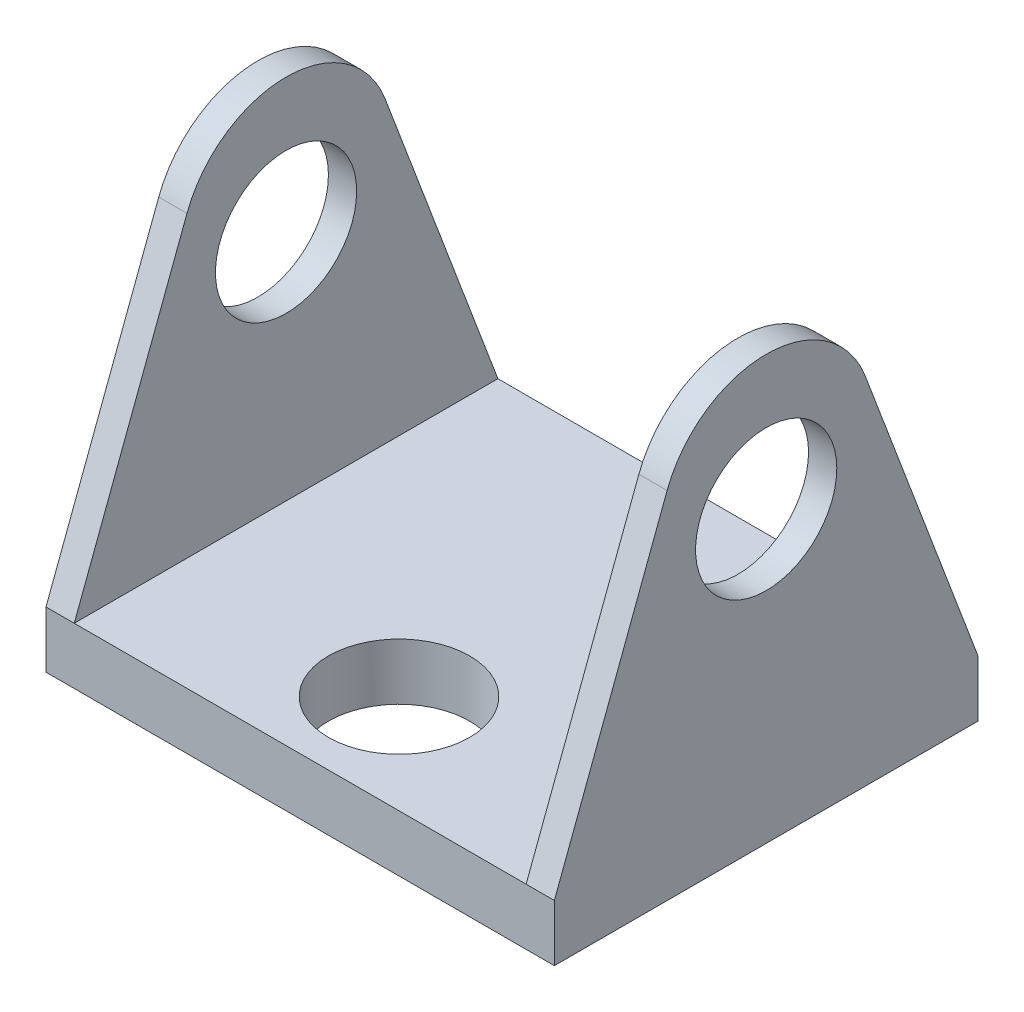
ISO-10303-21;
HEADER;
FILE_DESCRIPTION(('STEP AP214'),'2;1');
FILE_NAME('part.step','',(''),(''),'','','');
FILE_SCHEMA(('AUTOMOTIVE_DESIGN { 1 0 10303 214 1 1 1 1 }'));
ENDSEC;
DATA;
#1=APPLICATION_CONTEXT('core data for automotive mechanical design processes');
#2=APPLICATION_PROTOCOL_DEFINITION('international standard','automotive_design',2000,#1);
#3=PRODUCT_CONTEXT('',#1,'mechanical');
#4=PRODUCT('Part','Part','',(#3));
#5=PRODUCT_RELATED_PRODUCT_CATEGORY('part','',(#4));
#6=PRODUCT_DEFINITION_FORMATION('','',#4);
#7=PRODUCT_DEFINITION_CONTEXT('part definition',#1,'design');
#8=PRODUCT_DEFINITION('design','',#6,#7);
#9=PRODUCT_DEFINITION_SHAPE('','',#8);
#10=(LENGTH_UNIT() NAMED_UNIT(*) SI_UNIT(.MILLI.,.METRE.));
#11=(NAMED_UNIT(*) PLANE_ANGLE_UNIT() SI_UNIT($,.RADIAN.));
#12=(NAMED_UNIT(*) SI_UNIT($,.STERADIAN.) SOLID_ANGLE_UNIT());
#13=UNCERTAINTY_MEASURE_WITH_UNIT(LENGTH_MEASURE(1.E-05),#10,'distance_accuracy_value','');
#14=(GEOMETRIC_REPRESENTATION_CONTEXT(3) GLOBAL_UNCERTAINTY_ASSIGNED_CONTEXT((#13)) GLOBAL_UNIT_ASSIGNED_CONTEXT((#10,
#11,#12)) REPRESENTATION_CONTEXT('',''));
#15=CARTESIAN_POINT('',(0.,0.,0.));
#16=DIRECTION('',(0.,0.,1.));
#17=DIRECTION('',(1.,0.,0.));
#18=AXIS2_PLACEMENT_3D('',#15,#16,#17);
#19=CARTESIAN_POINT('',(-16.,0.,-30.));
#20=DIRECTION('',(1.,0.,0.));
#21=DIRECTION('',(0.,0.,-1.));
#22=AXIS2_PLACEMENT_3D('',#19,#20,#21);
#23=PLANE('',#22);
#24=CARTESIAN_POINT('',(-16.,18.5,-15.));
#25=DIRECTION('',(1.,0.,0.));
#26=DIRECTION('',(0.,0.,-1.));
#27=AXIS2_PLACEMENT_3D('',#24,#25,#26);
#28=CIRCLE('',#27,5.);
#29=CARTESIAN_POINT('',(-16.,18.5,-20.));
#30=VERTEX_POINT('',#29);
#31=EDGE_CURVE('E196',#30,#30,#28,.T.);
#32=ORIENTED_EDGE('',*,*,#31,.F.);
#33=EDGE_LOOP('',(#32));
#34=FACE_BOUND('',#33,.T.);
#35=CARTESIAN_POINT('',(-16.,20.5,-15.));
#36=DIRECTION('',(1.,0.,0.));
#37=DIRECTION('',(0.,0.,-1.));
#38=AXIS2_PLACEMENT_3D('',#35,#36,#37);
#39=CIRCLE('',#38,7.5);
#40=CARTESIAN_POINT('',(-16.,23.1486950638658,-22.0167239121012));
#41=VERTEX_POINT('',#40);
#42=CARTESIAN_POINT('',(-16.,23.1486950638658,-7.9832760878988));
#43=VERTEX_POINT('',#42);
#44=EDGE_CURVE('E239',#41,#43,#39,.T.);
#45=ORIENTED_EDGE('',*,*,#44,.T.);
#46=DIRECTION('',(0.,-0.93556318828016,0.353159341848778));
#47=VECTOR('',#46,1.);
#48=CARTESIAN_POINT('',(-16.,10.1615294363991,-3.08083986238993));
#49=LINE('',#48,#47);
#50=CARTESIAN_POINT('',(-16.,2.,0.));
#51=VERTEX_POINT('',#50);
#52=EDGE_CURVE('E145',#43,#51,#49,.T.);
#53=ORIENTED_EDGE('',*,*,#52,.T.);
#54=DIRECTION('',(0.,0.,1.));
#55=VECTOR('',#54,1.);
#56=CARTESIAN_POINT('',(-16.,2.,-30.));
#57=LINE('',#56,#55);
#58=CARTESIAN_POINT('',(-16.,2.,-30.));
#59=VERTEX_POINT('',#58);
#60=EDGE_CURVE('E157',#59,#51,#57,.T.);
#61=ORIENTED_EDGE('',*,*,#60,.F.);
#62=DIRECTION('',(0.,-0.93556318828016,-0.353159341848778));
#63=VECTOR('',#62,1.);
#64=CARTESIAN_POINT('',(-16.,0.249443041470123,-30.6608057596619));
#65=LINE('',#64,#63);
#66=EDGE_CURVE('E235',#41,#59,#65,.T.);
#67=ORIENTED_EDGE('',*,*,#66,.F.);
#68=EDGE_LOOP('',(#45,#53,#61,#67));
#69=FACE_BOUND('',#68,.T.);
#70=ADVANCED_FACE('F93',(#34,#69),#23,.T.);
#71=CARTESIAN_POINT('',(16.,0.,-30.));
#72=DIRECTION('',(1.,0.,0.));
#73=DIRECTION('',(0.,0.,-1.));
#74=AXIS2_PLACEMENT_3D('',#71,#72,#73);
#75=PLANE('',#74);
#76=CARTESIAN_POINT('',(16.,18.5,-15.));
#77=DIRECTION('',(1.,0.,0.));
#78=DIRECTION('',(0.,0.,-1.));
#79=AXIS2_PLACEMENT_3D('',#76,#77,#78);
#80=CIRCLE('',#79,5.);
#81=CARTESIAN_POINT('',(16.,18.5,-20.));
#82=VERTEX_POINT('',#81);
#83=EDGE_CURVE('E242',#82,#82,#80,.T.);
#84=ORIENTED_EDGE('',*,*,#83,.T.);
#85=EDGE_LOOP('',(#84));
#86=FACE_BOUND('',#85,.T.);
#87=DIRECTION('',(0.,-0.93556318828016,0.353159341848778));
#88=VECTOR('',#87,1.);
#89=CARTESIAN_POINT('',(16.,10.1615294363991,-3.08083986238993));
#90=LINE('',#89,#88);
#91=CARTESIAN_POINT('',(16.,23.1486950638658,-7.9832760878988));
#92=VERTEX_POINT('',#91);
#93=CARTESIAN_POINT('',(16.,2.,0.));
#94=VERTEX_POINT('',#93);
#95=EDGE_CURVE('E133',#92,#94,#90,.T.);
#96=ORIENTED_EDGE('',*,*,#95,.F.);
#97=CARTESIAN_POINT('',(16.,20.5,-15.));
#98=DIRECTION('',(1.,0.,0.));
#99=DIRECTION('',(0.,0.,-1.));
#100=AXIS2_PLACEMENT_3D('',#97,#98,#99);
#101=CIRCLE('',#100,7.5);
#102=CARTESIAN_POINT('',(16.,23.1486950638658,-22.0167239121012));
#103=VERTEX_POINT('',#102);
#104=EDGE_CURVE('E238',#103,#92,#101,.T.);
#105=ORIENTED_EDGE('',*,*,#104,.F.);
#106=DIRECTION('',(0.,-0.93556318828016,-0.353159341848778));
#107=VECTOR('',#106,1.);
#108=CARTESIAN_POINT('',(16.,0.249443041470123,-30.6608057596619));
#109=LINE('',#108,#107);
#110=CARTESIAN_POINT('',(16.,2.,-30.));
#111=VERTEX_POINT('',#110);
#112=EDGE_CURVE('E171',#103,#111,#109,.T.);
#113=ORIENTED_EDGE('',*,*,#112,.T.);
#114=DIRECTION('',(0.,0.,1.));
#115=VECTOR('',#114,1.);
#116=CARTESIAN_POINT('',(16.,2.,-30.));
#117=LINE('',#116,#115);
#118=EDGE_CURVE('E164',#111,#94,#117,.T.);
#119=ORIENTED_EDGE('',*,*,#118,.T.);
#120=EDGE_LOOP('',(#96,#105,#113,#119));
#121=FACE_BOUND('',#120,.T.);
#122=ADVANCED_FACE('F169',(#86,#121),#75,.F.);
#123=CARTESIAN_POINT('',(18.,0.,-30.));
#124=DIRECTION('',(1.,0.,0.));
#125=DIRECTION('',(0.,0.,-1.));
#126=AXIS2_PLACEMENT_3D('',#123,#124,#125);
#127=PLANE('',#126);
#128=CARTESIAN_POINT('',(18.,18.5,-15.));
#129=DIRECTION('',(1.,0.,0.));
#130=DIRECTION('',(0.,0.,-1.));
#131=AXIS2_PLACEMENT_3D('',#128,#129,#130);
#132=CIRCLE('',#131,5.);
#133=CARTESIAN_POINT('',(18.,18.5,-20.));
#134=VERTEX_POINT('',#133);
#135=EDGE_CURVE('E283',#134,#134,#132,.T.);
#136=ORIENTED_EDGE('',*,*,#135,.F.);
#137=EDGE_LOOP('',(#136));
#138=FACE_BOUND('',#137,.T.);
#139=CARTESIAN_POINT('',(18.,20.5,-15.));
#140=DIRECTION('',(1.,0.,0.));
#141=DIRECTION('',(0.,0.,-1.));
#142=AXIS2_PLACEMENT_3D('',#139,#140,#141);
#143=CIRCLE('',#142,7.5);
#144=CARTESIAN_POINT('',(18.,23.1486950638658,-22.0167239121012));
#145=VERTEX_POINT('',#144);
#146=CARTESIAN_POINT('',(18.,23.1486950638658,-7.9832760878988));
#147=VERTEX_POINT('',#146);
#148=EDGE_CURVE('E206',#145,#147,#143,.T.);
#149=ORIENTED_EDGE('',*,*,#148,.T.);
#150=DIRECTION('',(0.,-0.93556318828016,0.353159341848778));
#151=VECTOR('',#150,1.);
#152=CARTESIAN_POINT('',(18.,0.249443041470125,0.660805759661934));
#153=LINE('',#152,#151);
#154=CARTESIAN_POINT('',(18.,2.,0.));
#155=VERTEX_POINT('',#154);
#156=EDGE_CURVE('E202',#147,#155,#153,.T.);
#157=ORIENTED_EDGE('',*,*,#156,.T.);
#158=DIRECTION('',(0.,1.,0.));
#159=VECTOR('',#158,1.);
#160=CARTESIAN_POINT('',(18.,0.,0.));
#161=LINE('',#160,#159);
#162=CARTESIAN_POINT('',(18.,-2.,0.));
#163=VERTEX_POINT('',#162);
#164=EDGE_CURVE('E156',#163,#155,#161,.T.);
#165=ORIENTED_EDGE('',*,*,#164,.F.);
#166=DIRECTION('',(0.,0.,1.));
#167=VECTOR('',#166,1.);
#168=CARTESIAN_POINT('',(18.,-2.,-30.));
#169=LINE('',#168,#167);
#170=CARTESIAN_POINT('',(18.,-2.,-30.));
#171=VERTEX_POINT('',#170);
#172=EDGE_CURVE('E116',#171,#163,#169,.T.);
#173=ORIENTED_EDGE('',*,*,#172,.F.);
#174=DIRECTION('',(0.,1.,0.));
#175=VECTOR('',#174,1.);
#176=CARTESIAN_POINT('',(18.,0.,-30.));
#177=LINE('',#176,#175);
#178=CARTESIAN_POINT('',(18.,2.,-30.));
#179=VERTEX_POINT('',#178);
#180=EDGE_CURVE('E185',#171,#179,#177,.T.);
#181=ORIENTED_EDGE('',*,*,#180,.T.);
#182=DIRECTION('',(0.,-0.93556318828016,-0.353159341848778));
#183=VECTOR('',#182,1.);
#184=CARTESIAN_POINT('',(18.,10.1615294363991,-26.9191601376101));
#185=LINE('',#184,#183);
#186=EDGE_CURVE('E210',#145,#179,#185,.T.);
#187=ORIENTED_EDGE('',*,*,#186,.F.);
#188=EDGE_LOOP('',(#149,#157,#165,#173,#181,#187));
#189=FACE_BOUND('',#188,.T.);
#190=ADVANCED_FACE('F201',(#138,#189),#127,.T.);
#191=CARTESIAN_POINT('',(-18.,0.,-30.));
#192=DIRECTION('',(1.,0.,0.));
#193=DIRECTION('',(0.,0.,-1.));
#194=AXIS2_PLACEMENT_3D('',#191,#192,#193);
#195=PLANE('',#194);
#196=CARTESIAN_POINT('',(-18.,18.5,-15.));
#197=DIRECTION('',(1.,0.,0.));
#198=DIRECTION('',(0.,0.,-1.));
#199=AXIS2_PLACEMENT_3D('',#196,#197,#198);
#200=CIRCLE('',#199,5.);
#201=CARTESIAN_POINT('',(-18.,18.5,-20.));
#202=VERTEX_POINT('',#201);
#203=EDGE_CURVE('E281',#202,#202,#200,.T.);
#204=ORIENTED_EDGE('',*,*,#203,.T.);
#205=EDGE_LOOP('',(#204));
#206=FACE_BOUND('',#205,.T.);
#207=DIRECTION('',(0.,-0.93556318828016,0.353159341848778));
#208=VECTOR('',#207,1.);
#209=CARTESIAN_POINT('',(-18.,0.249443041470125,0.660805759661934));
#210=LINE('',#209,#208);
#211=CARTESIAN_POINT('',(-18.,23.1486950638658,-7.9832760878988));
#212=VERTEX_POINT('',#211);
#213=CARTESIAN_POINT('',(-18.,2.,0.));
#214=VERTEX_POINT('',#213);
#215=EDGE_CURVE('E107',#212,#214,#210,.T.);
#216=ORIENTED_EDGE('',*,*,#215,.F.);
#217=CARTESIAN_POINT('',(-18.,20.5,-15.));
#218=DIRECTION('',(1.,0.,0.));
#219=DIRECTION('',(0.,0.,-1.));
#220=AXIS2_PLACEMENT_3D('',#217,#218,#219);
#221=CIRCLE('',#220,7.5);
#222=CARTESIAN_POINT('',(-18.,23.1486950638658,-22.0167239121012));
#223=VERTEX_POINT('',#222);
#224=EDGE_CURVE('E209',#223,#212,#221,.T.);
#225=ORIENTED_EDGE('',*,*,#224,.F.);
#226=DIRECTION('',(0.,-0.93556318828016,-0.353159341848778));
#227=VECTOR('',#226,1.);
#228=CARTESIAN_POINT('',(-18.,10.1615294363991,-26.9191601376101));
#229=LINE('',#228,#227);
#230=CARTESIAN_POINT('',(-18.,2.,-30.));
#231=VERTEX_POINT('',#230);
#232=EDGE_CURVE('E213',#223,#231,#229,.T.);
#233=ORIENTED_EDGE('',*,*,#232,.T.);
#234=DIRECTION('',(0.,1.,0.));
#235=VECTOR('',#234,1.);
#236=CARTESIAN_POINT('',(-18.,0.,-30.));
#237=LINE('',#236,#235);
#238=CARTESIAN_POINT('',(-18.,-2.,-30.));
#239=VERTEX_POINT('',#238);
#240=EDGE_CURVE('E166',#239,#231,#237,.T.);
#241=ORIENTED_EDGE('',*,*,#240,.F.);
#242=DIRECTION('',(0.,0.,1.));
#243=VECTOR('',#242,1.);
#244=CARTESIAN_POINT('',(-18.,-2.,-30.));
#245=LINE('',#244,#243);
#246=CARTESIAN_POINT('',(-18.,-2.,0.));
#247=VERTEX_POINT('',#246);
#248=EDGE_CURVE('E175',#239,#247,#245,.T.);
#249=ORIENTED_EDGE('',*,*,#248,.T.);
#250=DIRECTION('',(0.,1.,0.));
#251=VECTOR('',#250,1.);
#252=CARTESIAN_POINT('',(-18.,0.,0.));
#253=LINE('',#252,#251);
#254=EDGE_CURVE('E193',#247,#214,#253,.T.);
#255=ORIENTED_EDGE('',*,*,#254,.T.);
#256=EDGE_LOOP('',(#216,#225,#233,#241,#249,#255));
#257=FACE_BOUND('',#256,.T.);
#258=ADVANCED_FACE('F310',(#206,#257),#195,.F.);
#259=CARTESIAN_POINT('',(0.,0.,0.));
#260=DIRECTION('',(0.,0.,1.));
#261=DIRECTION('',(1.,0.,0.));
#262=AXIS2_PLACEMENT_3D('',#259,#260,#261);
#263=PLANE('',#262);
#264=ORIENTED_EDGE('',*,*,#164,.T.);
#265=DIRECTION('',(-1.,0.,0.));
#266=VECTOR('',#265,1.);
#267=CARTESIAN_POINT('',(0.,2.,0.));
#268=LINE('',#267,#266);
#269=EDGE_CURVE('E100',#155,#94,#268,.T.);
#270=ORIENTED_EDGE('',*,*,#269,.T.);
#271=DIRECTION('',(1.,0.,0.));
#272=VECTOR('',#271,1.);
#273=CARTESIAN_POINT('',(0.,2.,0.));
#274=LINE('',#273,#272);
#275=EDGE_CURVE('E154',#51,#94,#274,.T.);
#276=ORIENTED_EDGE('',*,*,#275,.F.);
#277=DIRECTION('',(1.,0.,0.));
#278=VECTOR('',#277,1.);
#279=CARTESIAN_POINT('',(-18.,2.,0.));
#280=LINE('',#279,#278);
#281=EDGE_CURVE('E225',#214,#51,#280,.T.);
#282=ORIENTED_EDGE('',*,*,#281,.F.);
#283=ORIENTED_EDGE('',*,*,#254,.F.);
#284=DIRECTION('',(-1.,0.,0.));
#285=VECTOR('',#284,1.);
#286=CARTESIAN_POINT('',(0.,-2.,0.));
#287=LINE('',#286,#285);
#288=EDGE_CURVE('E195',#163,#247,#287,.T.);
#289=ORIENTED_EDGE('',*,*,#288,.F.);
#290=EDGE_LOOP('',(#264,#270,#276,#282,#283,#289));
#291=FACE_BOUND('',#290,.T.);
#292=ADVANCED_FACE('F152',(#291),#263,.T.);
#293=CARTESIAN_POINT('',(0.,2.,-30.));
#294=DIRECTION('',(0.,-1.,0.));
#295=DIRECTION('',(0.,0.,-1.));
#296=AXIS2_PLACEMENT_3D('',#293,#294,#295);
#297=PLANE('',#296);
#298=CARTESIAN_POINT('',(0.,2.,-7.));
#299=DIRECTION('',(0.,-1.,0.));
#300=DIRECTION('',(0.,0.,-1.));
#301=AXIS2_PLACEMENT_3D('',#298,#299,#300);
#302=CIRCLE('',#301,5.);
#303=CARTESIAN_POINT('',(0.,2.,-12.));
#304=VERTEX_POINT('',#303);
#305=EDGE_CURVE('E288',#304,#304,#302,.T.);
#306=ORIENTED_EDGE('',*,*,#305,.T.);
#307=EDGE_LOOP('',(#306));
#308=FACE_BOUND('',#307,.T.);
#309=ORIENTED_EDGE('',*,*,#275,.T.);
#310=ORIENTED_EDGE('',*,*,#118,.F.);
#311=DIRECTION('',(1.,0.,0.));
#312=VECTOR('',#311,1.);
#313=CARTESIAN_POINT('',(0.,2.,-30.));
#314=LINE('',#313,#312);
#315=EDGE_CURVE('E179',#59,#111,#314,.T.);
#316=ORIENTED_EDGE('',*,*,#315,.F.);
#317=ORIENTED_EDGE('',*,*,#60,.T.);
#318=EDGE_LOOP('',(#309,#310,#316,#317));
#319=FACE_BOUND('',#318,.T.);
#320=ADVANCED_FACE('F161',(#308,#319),#297,.F.);
#321=CARTESIAN_POINT('',(0.,-2.,-30.));
#322=DIRECTION('',(0.,1.,0.));
#323=DIRECTION('',(0.,0.,1.));
#324=AXIS2_PLACEMENT_3D('',#321,#322,#323);
#325=PLANE('',#324);
#326=CARTESIAN_POINT('',(0.,-2.,-7.));
#327=DIRECTION('',(0.,1.,0.));
#328=DIRECTION('',(0.,0.,1.));
#329=AXIS2_PLACEMENT_3D('',#326,#327,#328);
#330=CIRCLE('',#329,5.);
#331=CARTESIAN_POINT('',(0.,-2.,-2.));
#332=VERTEX_POINT('',#331);
#333=EDGE_CURVE('E291',#332,#332,#330,.T.);
#334=ORIENTED_EDGE('',*,*,#333,.T.);
#335=EDGE_LOOP('',(#334));
#336=FACE_BOUND('',#335,.T.);
#337=ORIENTED_EDGE('',*,*,#288,.T.);
#338=ORIENTED_EDGE('',*,*,#248,.F.);
#339=DIRECTION('',(-1.,0.,0.));
#340=VECTOR('',#339,1.);
#341=CARTESIAN_POINT('',(0.,-2.,-30.));
#342=LINE('',#341,#340);
#343=EDGE_CURVE('E189',#171,#239,#342,.T.);
#344=ORIENTED_EDGE('',*,*,#343,.F.);
#345=ORIENTED_EDGE('',*,*,#172,.T.);
#346=EDGE_LOOP('',(#337,#338,#344,#345));
#347=FACE_BOUND('',#346,.T.);
#348=ADVANCED_FACE('F199',(#336,#347),#325,.F.);
#349=CARTESIAN_POINT('',(0.,0.,-30.));
#350=DIRECTION('',(0.,0.,1.));
#351=DIRECTION('',(1.,0.,0.));
#352=AXIS2_PLACEMENT_3D('',#349,#350,#351);
#353=PLANE('',#352);
#354=ORIENTED_EDGE('',*,*,#240,.T.);
#355=DIRECTION('',(1.,0.,0.));
#356=VECTOR('',#355,1.);
#357=CARTESIAN_POINT('',(-18.,2.,-30.));
#358=LINE('',#357,#356);
#359=EDGE_CURVE('E227',#231,#59,#358,.T.);
#360=ORIENTED_EDGE('',*,*,#359,.T.);
#361=ORIENTED_EDGE('',*,*,#315,.T.);
#362=DIRECTION('',(1.,0.,0.));
#363=VECTOR('',#362,1.);
#364=CARTESIAN_POINT('',(0.,1.99999999999999,-30.));
#365=LINE('',#364,#363);
#366=EDGE_CURVE('E12',#111,#179,#365,.T.);
#367=ORIENTED_EDGE('',*,*,#366,.T.);
#368=ORIENTED_EDGE('',*,*,#180,.F.);
#369=ORIENTED_EDGE('',*,*,#343,.T.);
#370=EDGE_LOOP('',(#354,#360,#361,#367,#368,#369));
#371=FACE_BOUND('',#370,.T.);
#372=ADVANCED_FACE('F251',(#371),#353,.F.);
#373=CARTESIAN_POINT('',(-18.,0.249443041470125,0.660805759661934));
#374=DIRECTION('',(0.,0.353159341848778,0.93556318828016));
#375=DIRECTION('',(0.,-0.93556318828016,0.353159341848778));
#376=AXIS2_PLACEMENT_3D('',#373,#374,#375);
#377=PLANE('',#376);
#378=DIRECTION('',(1.,0.,0.));
#379=VECTOR('',#378,1.);
#380=CARTESIAN_POINT('',(-18.,23.1486950638658,-7.9832760878988));
#381=LINE('',#380,#379);
#382=EDGE_CURVE('E146',#212,#43,#381,.T.);
#383=ORIENTED_EDGE('',*,*,#382,.F.);
#384=ORIENTED_EDGE('',*,*,#215,.T.);
#385=ORIENTED_EDGE('',*,*,#281,.T.);
#386=ORIENTED_EDGE('',*,*,#52,.F.);
#387=EDGE_LOOP('',(#383,#384,#385,#386));
#388=FACE_BOUND('',#387,.T.);
#389=ADVANCED_FACE('F324',(#388),#377,.T.);
#390=CARTESIAN_POINT('',(-18.,10.1615294363991,-26.9191601376101));
#391=DIRECTION('',(0.,-0.353159341848778,0.93556318828016));
#392=DIRECTION('',(0.,-0.93556318828016,-0.353159341848778));
#393=AXIS2_PLACEMENT_3D('',#390,#391,#392);
#394=PLANE('',#393);
#395=ORIENTED_EDGE('',*,*,#66,.T.);
#396=ORIENTED_EDGE('',*,*,#359,.F.);
#397=ORIENTED_EDGE('',*,*,#232,.F.);
#398=DIRECTION('',(1.,0.,0.));
#399=VECTOR('',#398,1.);
#400=CARTESIAN_POINT('',(-18.,23.1486950638658,-22.0167239121012));
#401=LINE('',#400,#399);
#402=EDGE_CURVE('E229',#223,#41,#401,.T.);
#403=ORIENTED_EDGE('',*,*,#402,.T.);
#404=EDGE_LOOP('',(#395,#396,#397,#403));
#405=FACE_BOUND('',#404,.T.);
#406=ADVANCED_FACE('F329',(#405),#394,.F.);
#407=CARTESIAN_POINT('',(-18.,20.5,-15.));
#408=DIRECTION('',(1.,0.,0.));
#409=DIRECTION('',(0.,0.,-1.));
#410=AXIS2_PLACEMENT_3D('',#407,#408,#409);
#411=CYLINDRICAL_SURFACE('',#410,7.5);
#412=ORIENTED_EDGE('',*,*,#402,.F.);
#413=ORIENTED_EDGE('',*,*,#224,.T.);
#414=ORIENTED_EDGE('',*,*,#382,.T.);
#415=ORIENTED_EDGE('',*,*,#44,.F.);
#416=EDGE_LOOP('',(#412,#413,#414,#415));
#417=FACE_BOUND('',#416,.T.);
#418=ADVANCED_FACE('F325',(#417),#411,.T.);
#419=ORIENTED_EDGE('',*,*,#104,.T.);
#420=EDGE_CURVE('E141',#92,#147,#381,.T.);
#421=ORIENTED_EDGE('',*,*,#420,.T.);
#422=ORIENTED_EDGE('',*,*,#148,.F.);
#423=EDGE_CURVE('E222',#103,#145,#401,.T.);
#424=ORIENTED_EDGE('',*,*,#423,.F.);
#425=EDGE_LOOP('',(#419,#421,#422,#424));
#426=FACE_BOUND('',#425,.T.);
#427=ADVANCED_FACE('F280',(#426),#411,.T.);
#428=ORIENTED_EDGE('',*,*,#423,.T.);
#429=ORIENTED_EDGE('',*,*,#186,.T.);
#430=ORIENTED_EDGE('',*,*,#366,.F.);
#431=ORIENTED_EDGE('',*,*,#112,.F.);
#432=EDGE_LOOP('',(#428,#429,#430,#431));
#433=FACE_BOUND('',#432,.T.);
#434=ADVANCED_FACE('F278',(#433),#394,.F.);
#435=ORIENTED_EDGE('',*,*,#95,.T.);
#436=ORIENTED_EDGE('',*,*,#269,.F.);
#437=ORIENTED_EDGE('',*,*,#156,.F.);
#438=ORIENTED_EDGE('',*,*,#420,.F.);
#439=EDGE_LOOP('',(#435,#436,#437,#438));
#440=FACE_BOUND('',#439,.T.);
#441=ADVANCED_FACE('F135',(#440),#377,.T.);
#442=CARTESIAN_POINT('',(-18.,18.5,-15.));
#443=DIRECTION('',(1.,0.,0.));
#444=DIRECTION('',(0.,0.,-1.));
#445=AXIS2_PLACEMENT_3D('',#442,#443,#444);
#446=CYLINDRICAL_SURFACE('',#445,5.);
#447=ORIENTED_EDGE('',*,*,#31,.T.);
#448=EDGE_LOOP('',(#447));
#449=FACE_BOUND('',#448,.T.);
#450=ORIENTED_EDGE('',*,*,#203,.F.);
#451=EDGE_LOOP('',(#450));
#452=FACE_BOUND('',#451,.T.);
#453=ADVANCED_FACE('F343',(#449,#452),#446,.F.);
#454=ORIENTED_EDGE('',*,*,#135,.T.);
#455=EDGE_LOOP('',(#454));
#456=FACE_BOUND('',#455,.T.);
#457=ORIENTED_EDGE('',*,*,#83,.F.);
#458=EDGE_LOOP('',(#457));
#459=FACE_BOUND('',#458,.T.);
#460=ADVANCED_FACE('F299',(#456,#459),#446,.F.);
#461=CARTESIAN_POINT('',(0.,-2.,-7.));
#462=DIRECTION('',(0.,1.,0.));
#463=DIRECTION('',(0.,0.,1.));
#464=AXIS2_PLACEMENT_3D('',#461,#462,#463);
#465=CYLINDRICAL_SURFACE('',#464,5.);
#466=ORIENTED_EDGE('',*,*,#333,.F.);
#467=EDGE_LOOP('',(#466));
#468=FACE_BOUND('',#467,.T.);
#469=ORIENTED_EDGE('',*,*,#305,.F.);
#470=EDGE_LOOP('',(#469));
#471=FACE_BOUND('',#470,.T.);
#472=ADVANCED_FACE('F296',(#468,#471),#465,.F.);
#473=CLOSED_SHELL('',(#70,#122,#190,#258,#292,#320,#348,#372,#389,#406,#418,#427,#434,#441,#453,
#460,#472));
#474=MANIFOLD_SOLID_BREP('B2',#473);
#475=ADVANCED_BREP_SHAPE_REPRESENTATION('',(#18,#474),#14);
#476=SHAPE_DEFINITION_REPRESENTATION(#9,#475);
ENDSEC;
END-ISO-10303-21;
